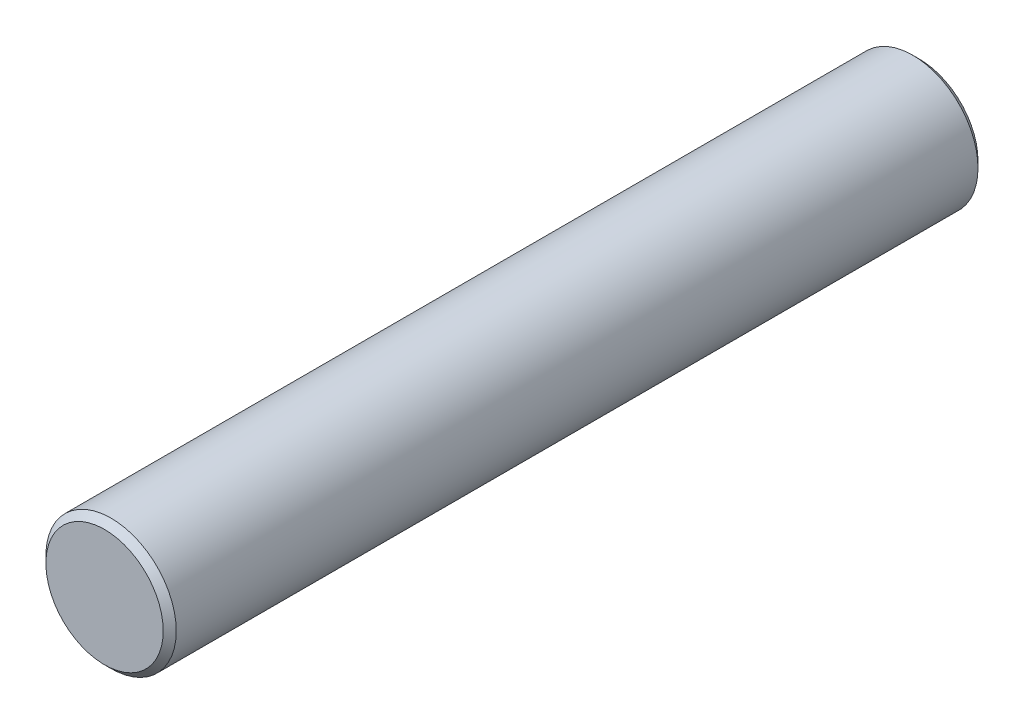
ISO-10303-21;
HEADER;
FILE_DESCRIPTION(('STEP AP214'),'2;1');
FILE_NAME('part.step','',(''),(''),'','','');
FILE_SCHEMA(('AUTOMOTIVE_DESIGN { 1 0 10303 214 1 1 1 1 }'));
ENDSEC;
DATA;
#1=APPLICATION_CONTEXT('core data for automotive mechanical design processes');
#2=APPLICATION_PROTOCOL_DEFINITION('international standard','automotive_design',2000,#1);
#3=PRODUCT_CONTEXT('',#1,'mechanical');
#4=PRODUCT('Part','Part','',(#3));
#5=PRODUCT_RELATED_PRODUCT_CATEGORY('part','',(#4));
#6=PRODUCT_DEFINITION_FORMATION('','',#4);
#7=PRODUCT_DEFINITION_CONTEXT('part definition',#1,'design');
#8=PRODUCT_DEFINITION('design','',#6,#7);
#9=PRODUCT_DEFINITION_SHAPE('','',#8);
#10=(LENGTH_UNIT() NAMED_UNIT(*) SI_UNIT(.MILLI.,.METRE.));
#11=(NAMED_UNIT(*) PLANE_ANGLE_UNIT() SI_UNIT($,.RADIAN.));
#12=(NAMED_UNIT(*) SI_UNIT($,.STERADIAN.) SOLID_ANGLE_UNIT());
#13=UNCERTAINTY_MEASURE_WITH_UNIT(LENGTH_MEASURE(1.E-05),#10,'distance_accuracy_value','');
#14=(GEOMETRIC_REPRESENTATION_CONTEXT(3) GLOBAL_UNCERTAINTY_ASSIGNED_CONTEXT((#13)) GLOBAL_UNIT_ASSIGNED_CONTEXT((#10,
#11,#12)) REPRESENTATION_CONTEXT('',''));
#15=CARTESIAN_POINT('',(0.,0.,0.));
#16=DIRECTION('',(0.,0.,1.));
#17=DIRECTION('',(1.,0.,0.));
#18=AXIS2_PLACEMENT_3D('',#15,#16,#17);
#19=CARTESIAN_POINT('',(0.,0.,125.));
#20=DIRECTION('',(0.,0.,-1.));
#21=DIRECTION('',(-1.,0.,0.));
#22=AXIS2_PLACEMENT_3D('',#19,#20,#21);
#23=CYLINDRICAL_SURFACE('',#22,10.);
#24=CARTESIAN_POINT('',(0.,0.,124.));
#25=DIRECTION('',(0.,0.,1.));
#26=DIRECTION('',(1.,0.,0.));
#27=AXIS2_PLACEMENT_3D('',#24,#25,#26);
#28=CIRCLE('',#27,10.);
#29=CARTESIAN_POINT('',(10.,0.,124.));
#30=VERTEX_POINT('',#29);
#31=EDGE_CURVE('E40',#30,#30,#28,.F.);
#32=ORIENTED_EDGE('',*,*,#31,.T.);
#33=EDGE_LOOP('',(#32));
#34=FACE_BOUND('',#33,.T.);
#35=CARTESIAN_POINT('',(0.,0.,0.999999999999987));
#36=DIRECTION('',(0.,0.,1.));
#37=DIRECTION('',(1.,0.,0.));
#38=AXIS2_PLACEMENT_3D('',#35,#36,#37);
#39=CIRCLE('',#38,10.);
#40=CARTESIAN_POINT('',(10.,0.,0.999999999999987));
#41=VERTEX_POINT('',#40);
#42=EDGE_CURVE('E44',#41,#41,#39,.T.);
#43=ORIENTED_EDGE('',*,*,#42,.T.);
#44=EDGE_LOOP('',(#43));
#45=FACE_BOUND('',#44,.T.);
#46=ADVANCED_FACE('F33',(#34,#45),#23,.T.);
#47=CARTESIAN_POINT('',(0.,0.,125.));
#48=DIRECTION('',(0.,0.,1.));
#49=DIRECTION('',(1.,0.,0.));
#50=AXIS2_PLACEMENT_3D('',#47,#48,#49);
#51=PLANE('',#50);
#52=CARTESIAN_POINT('',(0.,0.,125.));
#53=DIRECTION('',(0.,0.,1.));
#54=DIRECTION('',(1.,0.,0.));
#55=AXIS2_PLACEMENT_3D('',#52,#53,#54);
#56=CIRCLE('',#55,8.99999999999999);
#57=CARTESIAN_POINT('',(8.99999999999999,0.,125.));
#58=VERTEX_POINT('',#57);
#59=EDGE_CURVE('E48',#58,#58,#56,.T.);
#60=ORIENTED_EDGE('',*,*,#59,.T.);
#61=EDGE_LOOP('',(#60));
#62=FACE_BOUND('',#61,.T.);
#63=ADVANCED_FACE('F54',(#62),#51,.T.);
#64=CARTESIAN_POINT('',(0.,0.,0.));
#65=DIRECTION('',(0.,0.,1.));
#66=DIRECTION('',(1.,0.,0.));
#67=AXIS2_PLACEMENT_3D('',#64,#65,#66);
#68=PLANE('',#67);
#69=CARTESIAN_POINT('',(0.,0.,0.));
#70=DIRECTION('',(0.,0.,1.));
#71=DIRECTION('',(1.,0.,0.));
#72=AXIS2_PLACEMENT_3D('',#69,#70,#71);
#73=CIRCLE('',#72,9.00000000000001);
#74=CARTESIAN_POINT('',(9.00000000000001,0.,0.));
#75=VERTEX_POINT('',#74);
#76=EDGE_CURVE('E10',#75,#75,#73,.F.);
#77=ORIENTED_EDGE('',*,*,#76,.T.);
#78=EDGE_LOOP('',(#77));
#79=FACE_BOUND('',#78,.T.);
#80=ADVANCED_FACE('F58',(#79),#68,.F.);
#81=CARTESIAN_POINT('',(0.,0.,125.));
#82=DIRECTION('',(0.,0.,-1.));
#83=DIRECTION('',(-1.,0.,0.));
#84=AXIS2_PLACEMENT_3D('',#81,#82,#83);
#85=CONICAL_SURFACE('',#84,8.99999999999999,0.785398163397437);
#86=ORIENTED_EDGE('',*,*,#31,.F.);
#87=EDGE_LOOP('',(#86));
#88=FACE_BOUND('',#87,.T.);
#89=ORIENTED_EDGE('',*,*,#59,.F.);
#90=EDGE_LOOP('',(#89));
#91=FACE_BOUND('',#90,.T.);
#92=ADVANCED_FACE('F56',(#88,#91),#85,.T.);
#93=CARTESIAN_POINT('',(0.,0.,0.999999999999987));
#94=DIRECTION('',(0.,0.,1.));
#95=DIRECTION('',(1.,0.,0.));
#96=AXIS2_PLACEMENT_3D('',#93,#94,#95);
#97=CONICAL_SURFACE('',#96,10.,0.785398163397451);
#98=ORIENTED_EDGE('',*,*,#76,.F.);
#99=EDGE_LOOP('',(#98));
#100=FACE_BOUND('',#99,.T.);
#101=ORIENTED_EDGE('',*,*,#42,.F.);
#102=EDGE_LOOP('',(#101));
#103=FACE_BOUND('',#102,.T.);
#104=ADVANCED_FACE('F35',(#100,#103),#97,.T.);
#105=CLOSED_SHELL('',(#46,#63,#80,#92,#104));
#106=MANIFOLD_SOLID_BREP('B2',#105);
#107=ADVANCED_BREP_SHAPE_REPRESENTATION('',(#18,#106),#14);
#108=SHAPE_DEFINITION_REPRESENTATION(#9,#107);
ENDSEC;
END-ISO-10303-21;
